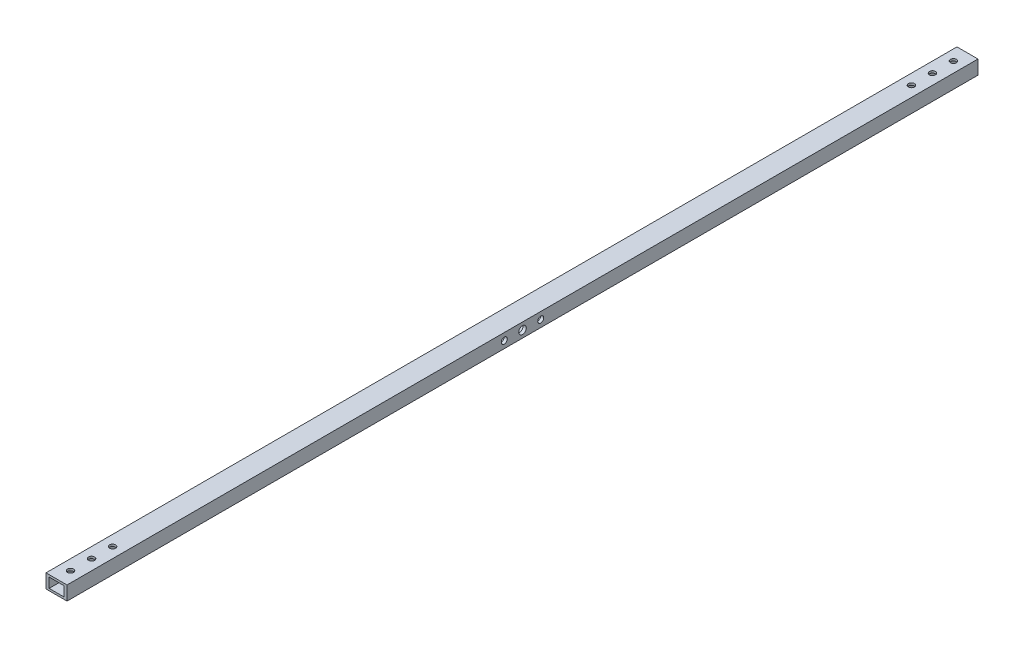
ISO-10303-21;
HEADER;
FILE_DESCRIPTION(('STEP AP214'),'2;1');
FILE_NAME('part.step','',(''),(''),'','','');
FILE_SCHEMA(('AUTOMOTIVE_DESIGN { 1 0 10303 214 1 1 1 1 }'));
ENDSEC;
DATA;
#1=APPLICATION_CONTEXT('core data for automotive mechanical design processes');
#2=APPLICATION_PROTOCOL_DEFINITION('international standard','automotive_design',2000,#1);
#3=PRODUCT_CONTEXT('',#1,'mechanical');
#4=PRODUCT('Part','Part','',(#3));
#5=PRODUCT_RELATED_PRODUCT_CATEGORY('part','',(#4));
#6=PRODUCT_DEFINITION_FORMATION('','',#4);
#7=PRODUCT_DEFINITION_CONTEXT('part definition',#1,'design');
#8=PRODUCT_DEFINITION('design','',#6,#7);
#9=PRODUCT_DEFINITION_SHAPE('','',#8);
#10=(LENGTH_UNIT() NAMED_UNIT(*) SI_UNIT(.MILLI.,.METRE.));
#11=(NAMED_UNIT(*) PLANE_ANGLE_UNIT() SI_UNIT($,.RADIAN.));
#12=(NAMED_UNIT(*) SI_UNIT($,.STERADIAN.) SOLID_ANGLE_UNIT());
#13=UNCERTAINTY_MEASURE_WITH_UNIT(LENGTH_MEASURE(1.E-05),#10,'distance_accuracy_value','');
#14=(GEOMETRIC_REPRESENTATION_CONTEXT(3) GLOBAL_UNCERTAINTY_ASSIGNED_CONTEXT((#13)) GLOBAL_UNIT_ASSIGNED_CONTEXT((#10,
#11,#12)) REPRESENTATION_CONTEXT('',''));
#15=CARTESIAN_POINT('',(0.,0.,0.));
#16=DIRECTION('',(0.,0.,1.));
#17=DIRECTION('',(1.,0.,0.));
#18=AXIS2_PLACEMENT_3D('',#15,#16,#17);
#19=CARTESIAN_POINT('',(0.,0.,650.));
#20=DIRECTION('',(0.,0.,1.));
#21=DIRECTION('',(1.,0.,0.));
#22=AXIS2_PLACEMENT_3D('',#19,#20,#21);
#23=PLANE('',#22);
#24=DIRECTION('',(0.,1.,0.));
#25=VECTOR('',#24,1.);
#26=CARTESIAN_POINT('',(7.5,5.,650.));
#27=LINE('',#26,#25);
#28=CARTESIAN_POINT('',(7.5,-5.,650.));
#29=VERTEX_POINT('',#28);
#30=CARTESIAN_POINT('',(7.5,5.,650.));
#31=VERTEX_POINT('',#30);
#32=EDGE_CURVE('E140',#29,#31,#27,.T.);
#33=ORIENTED_EDGE('',*,*,#32,.T.);
#34=DIRECTION('',(-1.,0.,0.));
#35=VECTOR('',#34,1.);
#36=CARTESIAN_POINT('',(-7.5,5.,650.));
#37=LINE('',#36,#35);
#38=CARTESIAN_POINT('',(-7.5,5.,650.));
#39=VERTEX_POINT('',#38);
#40=EDGE_CURVE('E143',#31,#39,#37,.T.);
#41=ORIENTED_EDGE('',*,*,#40,.T.);
#42=DIRECTION('',(0.,-1.,0.));
#43=VECTOR('',#42,1.);
#44=CARTESIAN_POINT('',(-7.5,5.,650.));
#45=LINE('',#44,#43);
#46=CARTESIAN_POINT('',(-7.5,-5.,650.));
#47=VERTEX_POINT('',#46);
#48=EDGE_CURVE('E146',#39,#47,#45,.T.);
#49=ORIENTED_EDGE('',*,*,#48,.T.);
#50=DIRECTION('',(1.,0.,0.));
#51=VECTOR('',#50,1.);
#52=CARTESIAN_POINT('',(-7.5,-5.,650.));
#53=LINE('',#52,#51);
#54=EDGE_CURVE('E148',#47,#29,#53,.T.);
#55=ORIENTED_EDGE('',*,*,#54,.T.);
#56=EDGE_LOOP('',(#33,#41,#49,#55));
#57=FACE_BOUND('',#56,.T.);
#58=DIRECTION('',(-1.,0.,0.));
#59=VECTOR('',#58,1.);
#60=CARTESIAN_POINT('',(-5.25,3.5,650.));
#61=LINE('',#60,#59);
#62=CARTESIAN_POINT('',(5.25,3.5,650.));
#63=VERTEX_POINT('',#62);
#64=CARTESIAN_POINT('',(-5.25,3.5,650.));
#65=VERTEX_POINT('',#64);
#66=EDGE_CURVE('E110',#63,#65,#61,.T.);
#67=ORIENTED_EDGE('',*,*,#66,.F.);
#68=DIRECTION('',(0.,1.,0.));
#69=VECTOR('',#68,1.);
#70=CARTESIAN_POINT('',(5.25,3.5,650.));
#71=LINE('',#70,#69);
#72=CARTESIAN_POINT('',(5.25,-3.5,650.));
#73=VERTEX_POINT('',#72);
#74=EDGE_CURVE('E102',#73,#63,#71,.T.);
#75=ORIENTED_EDGE('',*,*,#74,.F.);
#76=DIRECTION('',(1.,0.,0.));
#77=VECTOR('',#76,1.);
#78=CARTESIAN_POINT('',(-5.25,-3.5,650.));
#79=LINE('',#78,#77);
#80=CARTESIAN_POINT('',(-5.25,-3.5,650.));
#81=VERTEX_POINT('',#80);
#82=EDGE_CURVE('E124',#81,#73,#79,.T.);
#83=ORIENTED_EDGE('',*,*,#82,.F.);
#84=DIRECTION('',(0.,-1.,0.));
#85=VECTOR('',#84,1.);
#86=CARTESIAN_POINT('',(-5.25,3.5,650.));
#87=LINE('',#86,#85);
#88=EDGE_CURVE('E122',#65,#81,#87,.T.);
#89=ORIENTED_EDGE('',*,*,#88,.F.);
#90=EDGE_LOOP('',(#67,#75,#83,#89));
#91=FACE_BOUND('',#90,.T.);
#92=ADVANCED_FACE('F35',(#57,#91),#23,.T.);
#93=CARTESIAN_POINT('',(0.,0.,0.));
#94=DIRECTION('',(0.,0.,1.));
#95=DIRECTION('',(1.,0.,0.));
#96=AXIS2_PLACEMENT_3D('',#93,#94,#95);
#97=PLANE('',#96);
#98=DIRECTION('',(0.,1.,0.));
#99=VECTOR('',#98,1.);
#100=CARTESIAN_POINT('',(7.5,5.,0.));
#101=LINE('',#100,#99);
#102=CARTESIAN_POINT('',(7.5,-5.,0.));
#103=VERTEX_POINT('',#102);
#104=CARTESIAN_POINT('',(7.5,5.,0.));
#105=VERTEX_POINT('',#104);
#106=EDGE_CURVE('E118',#103,#105,#101,.T.);
#107=ORIENTED_EDGE('',*,*,#106,.F.);
#108=DIRECTION('',(1.,0.,0.));
#109=VECTOR('',#108,1.);
#110=CARTESIAN_POINT('',(-7.5,-5.,0.));
#111=LINE('',#110,#109);
#112=CARTESIAN_POINT('',(-7.5,-5.,0.));
#113=VERTEX_POINT('',#112);
#114=EDGE_CURVE('E144',#113,#103,#111,.T.);
#115=ORIENTED_EDGE('',*,*,#114,.F.);
#116=DIRECTION('',(0.,-1.,0.));
#117=VECTOR('',#116,1.);
#118=CARTESIAN_POINT('',(-7.5,5.,0.));
#119=LINE('',#118,#117);
#120=CARTESIAN_POINT('',(-7.5,5.,0.));
#121=VERTEX_POINT('',#120);
#122=EDGE_CURVE('E155',#121,#113,#119,.T.);
#123=ORIENTED_EDGE('',*,*,#122,.F.);
#124=DIRECTION('',(-1.,0.,0.));
#125=VECTOR('',#124,1.);
#126=CARTESIAN_POINT('',(-7.5,5.,0.));
#127=LINE('',#126,#125);
#128=EDGE_CURVE('E153',#105,#121,#127,.T.);
#129=ORIENTED_EDGE('',*,*,#128,.F.);
#130=EDGE_LOOP('',(#107,#115,#123,#129));
#131=FACE_BOUND('',#130,.T.);
#132=DIRECTION('',(0.,1.,0.));
#133=VECTOR('',#132,1.);
#134=CARTESIAN_POINT('',(5.25,3.5,0.));
#135=LINE('',#134,#133);
#136=CARTESIAN_POINT('',(5.25,-3.5,0.));
#137=VERTEX_POINT('',#136);
#138=CARTESIAN_POINT('',(5.25,3.5,0.));
#139=VERTEX_POINT('',#138);
#140=EDGE_CURVE('E60',#137,#139,#135,.T.);
#141=ORIENTED_EDGE('',*,*,#140,.T.);
#142=DIRECTION('',(-1.,0.,0.));
#143=VECTOR('',#142,1.);
#144=CARTESIAN_POINT('',(-5.25,3.5,0.));
#145=LINE('',#144,#143);
#146=CARTESIAN_POINT('',(-5.25,3.5,0.));
#147=VERTEX_POINT('',#146);
#148=EDGE_CURVE('E117',#139,#147,#145,.T.);
#149=ORIENTED_EDGE('',*,*,#148,.T.);
#150=DIRECTION('',(0.,-1.,0.));
#151=VECTOR('',#150,1.);
#152=CARTESIAN_POINT('',(-5.25,3.5,0.));
#153=LINE('',#152,#151);
#154=CARTESIAN_POINT('',(-5.25,-3.5,0.));
#155=VERTEX_POINT('',#154);
#156=EDGE_CURVE('E132',#147,#155,#153,.T.);
#157=ORIENTED_EDGE('',*,*,#156,.T.);
#158=DIRECTION('',(1.,0.,0.));
#159=VECTOR('',#158,1.);
#160=CARTESIAN_POINT('',(-5.25,-3.5,0.));
#161=LINE('',#160,#159);
#162=EDGE_CURVE('E111',#155,#137,#161,.T.);
#163=ORIENTED_EDGE('',*,*,#162,.T.);
#164=EDGE_LOOP('',(#141,#149,#157,#163));
#165=FACE_BOUND('',#164,.T.);
#166=ADVANCED_FACE('F298',(#131,#165),#97,.F.);
#167=CARTESIAN_POINT('',(7.5,5.,650.));
#168=DIRECTION('',(-1.,0.,0.));
#169=DIRECTION('',(0.,0.,1.));
#170=AXIS2_PLACEMENT_3D('',#167,#168,#169);
#171=PLANE('',#170);
#172=CARTESIAN_POINT('',(7.5,2.23575413423965E-13,338.));
#173=DIRECTION('',(1.,0.,0.));
#174=DIRECTION('',(0.,0.,-1.));
#175=AXIS2_PLACEMENT_3D('',#172,#173,#174);
#176=CIRCLE('',#175,2.1500000000001);
#177=CARTESIAN_POINT('',(7.5,2.23575413423965E-13,335.85));
#178=VERTEX_POINT('',#177);
#179=EDGE_CURVE('E339',#178,#178,#176,.T.);
#180=ORIENTED_EDGE('',*,*,#179,.F.);
#181=EDGE_LOOP('',(#180));
#182=FACE_BOUND('',#181,.T.);
#183=CARTESIAN_POINT('',(7.5,2.23575413423965E-13,312.));
#184=DIRECTION('',(1.,0.,0.));
#185=DIRECTION('',(0.,0.,-1.));
#186=AXIS2_PLACEMENT_3D('',#183,#184,#185);
#187=CIRCLE('',#186,2.1500000000001);
#188=CARTESIAN_POINT('',(7.5,2.23575413423965E-13,309.85));
#189=VERTEX_POINT('',#188);
#190=EDGE_CURVE('E333',#189,#189,#187,.T.);
#191=ORIENTED_EDGE('',*,*,#190,.F.);
#192=EDGE_LOOP('',(#191));
#193=FACE_BOUND('',#192,.T.);
#194=CARTESIAN_POINT('',(7.5,2.22981459726379E-13,325.));
#195=DIRECTION('',(1.,0.,0.));
#196=DIRECTION('',(0.,0.,-1.));
#197=AXIS2_PLACEMENT_3D('',#194,#195,#196);
#198=CIRCLE('',#197,2.70000000000016);
#199=CARTESIAN_POINT('',(7.5,2.22981459726379E-13,322.3));
#200=VERTEX_POINT('',#199);
#201=EDGE_CURVE('E205',#200,#200,#198,.T.);
#202=ORIENTED_EDGE('',*,*,#201,.F.);
#203=EDGE_LOOP('',(#202));
#204=FACE_BOUND('',#203,.T.);
#205=ORIENTED_EDGE('',*,*,#106,.T.);
#206=DIRECTION('',(0.,0.,-1.));
#207=VECTOR('',#206,1.);
#208=CARTESIAN_POINT('',(7.5,5.,650.));
#209=LINE('',#208,#207);
#210=EDGE_CURVE('E11',#31,#105,#209,.T.);
#211=ORIENTED_EDGE('',*,*,#210,.F.);
#212=ORIENTED_EDGE('',*,*,#32,.F.);
#213=DIRECTION('',(0.,0.,-1.));
#214=VECTOR('',#213,1.);
#215=CARTESIAN_POINT('',(7.5,-5.,650.));
#216=LINE('',#215,#214);
#217=EDGE_CURVE('E150',#29,#103,#216,.T.);
#218=ORIENTED_EDGE('',*,*,#217,.T.);
#219=EDGE_LOOP('',(#205,#211,#212,#218));
#220=FACE_BOUND('',#219,.T.);
#221=ADVANCED_FACE('F37',(#182,#193,#204,#220),#171,.F.);
#222=CARTESIAN_POINT('',(-7.5,5.,650.));
#223=DIRECTION('',(0.,-1.,0.));
#224=DIRECTION('',(0.,0.,-1.));
#225=AXIS2_PLACEMENT_3D('',#222,#223,#224);
#226=PLANE('',#225);
#227=CARTESIAN_POINT('',(0.,5.,640.));
#228=DIRECTION('',(0.,-1.,0.));
#229=DIRECTION('',(0.,0.,-1.));
#230=AXIS2_PLACEMENT_3D('',#227,#228,#229);
#231=CIRCLE('',#230,2.15);
#232=CARTESIAN_POINT('',(0.,5.,637.85));
#233=VERTEX_POINT('',#232);
#234=EDGE_CURVE('E169',#233,#233,#231,.T.);
#235=ORIENTED_EDGE('',*,*,#234,.T.);
#236=EDGE_LOOP('',(#235));
#237=FACE_BOUND('',#236,.T.);
#238=CARTESIAN_POINT('',(0.,5.,40.0000000000008));
#239=DIRECTION('',(0.,-1.,0.));
#240=DIRECTION('',(0.,0.,-1.));
#241=AXIS2_PLACEMENT_3D('',#238,#239,#240);
#242=CIRCLE('',#241,2.14999999999996);
#243=CARTESIAN_POINT('',(0.,5.,37.8500000000008));
#244=VERTEX_POINT('',#243);
#245=EDGE_CURVE('E218',#244,#244,#242,.T.);
#246=ORIENTED_EDGE('',*,*,#245,.T.);
#247=EDGE_LOOP('',(#246));
#248=FACE_BOUND('',#247,.T.);
#249=CARTESIAN_POINT('',(0.,5.,25.0000000000008));
#250=DIRECTION('',(0.,-1.,0.));
#251=DIRECTION('',(0.,0.,-1.));
#252=AXIS2_PLACEMENT_3D('',#249,#250,#251);
#253=CIRCLE('',#252,2.14999999999996);
#254=CARTESIAN_POINT('',(0.,5.,22.8500000000008));
#255=VERTEX_POINT('',#254);
#256=EDGE_CURVE('E241',#255,#255,#253,.T.);
#257=ORIENTED_EDGE('',*,*,#256,.T.);
#258=EDGE_LOOP('',(#257));
#259=FACE_BOUND('',#258,.T.);
#260=CARTESIAN_POINT('',(0.,5.,10.0000000000008));
#261=DIRECTION('',(0.,-1.,0.));
#262=DIRECTION('',(0.,0.,-1.));
#263=AXIS2_PLACEMENT_3D('',#260,#261,#262);
#264=CIRCLE('',#263,2.14999999999996);
#265=CARTESIAN_POINT('',(0.,5.,7.85000000000081));
#266=VERTEX_POINT('',#265);
#267=EDGE_CURVE('E235',#266,#266,#264,.T.);
#268=ORIENTED_EDGE('',*,*,#267,.T.);
#269=EDGE_LOOP('',(#268));
#270=FACE_BOUND('',#269,.T.);
#271=CARTESIAN_POINT('',(0.,5.,610.));
#272=DIRECTION('',(0.,-1.,0.));
#273=DIRECTION('',(0.,0.,-1.));
#274=AXIS2_PLACEMENT_3D('',#271,#272,#273);
#275=CIRCLE('',#274,2.15);
#276=CARTESIAN_POINT('',(0.,5.,607.85));
#277=VERTEX_POINT('',#276);
#278=EDGE_CURVE('E229',#277,#277,#275,.T.);
#279=ORIENTED_EDGE('',*,*,#278,.T.);
#280=EDGE_LOOP('',(#279));
#281=FACE_BOUND('',#280,.T.);
#282=CARTESIAN_POINT('',(0.,5.,625.));
#283=DIRECTION('',(0.,-1.,0.));
#284=DIRECTION('',(0.,0.,-1.));
#285=AXIS2_PLACEMENT_3D('',#282,#283,#284);
#286=CIRCLE('',#285,2.15);
#287=CARTESIAN_POINT('',(0.,5.,622.85));
#288=VERTEX_POINT('',#287);
#289=EDGE_CURVE('E217',#288,#288,#286,.T.);
#290=ORIENTED_EDGE('',*,*,#289,.T.);
#291=EDGE_LOOP('',(#290));
#292=FACE_BOUND('',#291,.T.);
#293=ORIENTED_EDGE('',*,*,#128,.T.);
#294=DIRECTION('',(0.,0.,-1.));
#295=VECTOR('',#294,1.);
#296=CARTESIAN_POINT('',(-7.5,5.,650.));
#297=LINE('',#296,#295);
#298=EDGE_CURVE('E44',#39,#121,#297,.T.);
#299=ORIENTED_EDGE('',*,*,#298,.F.);
#300=ORIENTED_EDGE('',*,*,#40,.F.);
#301=ORIENTED_EDGE('',*,*,#210,.T.);
#302=EDGE_LOOP('',(#293,#299,#300,#301));
#303=FACE_BOUND('',#302,.T.);
#304=ADVANCED_FACE('F284',(#237,#248,#259,#270,#281,#292,#303),#226,.F.);
#305=CARTESIAN_POINT('',(-7.5,5.,650.));
#306=DIRECTION('',(1.,0.,0.));
#307=DIRECTION('',(0.,0.,-1.));
#308=AXIS2_PLACEMENT_3D('',#305,#306,#307);
#309=PLANE('',#308);
#310=CARTESIAN_POINT('',(-7.5,2.23575413423965E-13,338.));
#311=DIRECTION('',(1.,0.,0.));
#312=DIRECTION('',(0.,0.,-1.));
#313=AXIS2_PLACEMENT_3D('',#310,#311,#312);
#314=CIRCLE('',#313,2.1500000000001);
#315=CARTESIAN_POINT('',(-7.5,2.23575413423965E-13,335.85));
#316=VERTEX_POINT('',#315);
#317=EDGE_CURVE('E192',#316,#316,#314,.T.);
#318=ORIENTED_EDGE('',*,*,#317,.T.);
#319=EDGE_LOOP('',(#318));
#320=FACE_BOUND('',#319,.T.);
#321=CARTESIAN_POINT('',(-7.5,2.23575413423965E-13,312.));
#322=DIRECTION('',(1.,0.,0.));
#323=DIRECTION('',(0.,0.,-1.));
#324=AXIS2_PLACEMENT_3D('',#321,#322,#323);
#325=CIRCLE('',#324,2.1500000000001);
#326=CARTESIAN_POINT('',(-7.5,2.23575413423965E-13,309.85));
#327=VERTEX_POINT('',#326);
#328=EDGE_CURVE('E328',#327,#327,#325,.T.);
#329=ORIENTED_EDGE('',*,*,#328,.T.);
#330=EDGE_LOOP('',(#329));
#331=FACE_BOUND('',#330,.T.);
#332=CARTESIAN_POINT('',(-7.5,2.22981459726379E-13,325.));
#333=DIRECTION('',(1.,0.,0.));
#334=DIRECTION('',(0.,0.,-1.));
#335=AXIS2_PLACEMENT_3D('',#332,#333,#334);
#336=CIRCLE('',#335,2.70000000000016);
#337=CARTESIAN_POINT('',(-7.5,2.22981459726379E-13,322.3));
#338=VERTEX_POINT('',#337);
#339=EDGE_CURVE('E331',#338,#338,#336,.T.);
#340=ORIENTED_EDGE('',*,*,#339,.T.);
#341=EDGE_LOOP('',(#340));
#342=FACE_BOUND('',#341,.T.);
#343=ORIENTED_EDGE('',*,*,#122,.T.);
#344=DIRECTION('',(0.,0.,-1.));
#345=VECTOR('',#344,1.);
#346=CARTESIAN_POINT('',(-7.5,-5.,650.));
#347=LINE('',#346,#345);
#348=EDGE_CURVE('E160',#47,#113,#347,.T.);
#349=ORIENTED_EDGE('',*,*,#348,.F.);
#350=ORIENTED_EDGE('',*,*,#48,.F.);
#351=ORIENTED_EDGE('',*,*,#298,.T.);
#352=EDGE_LOOP('',(#343,#349,#350,#351));
#353=FACE_BOUND('',#352,.T.);
#354=ADVANCED_FACE('F287',(#320,#331,#342,#353),#309,.F.);
#355=CARTESIAN_POINT('',(-7.5,-5.,650.));
#356=DIRECTION('',(0.,1.,0.));
#357=DIRECTION('',(0.,0.,1.));
#358=AXIS2_PLACEMENT_3D('',#355,#356,#357);
#359=PLANE('',#358);
#360=CARTESIAN_POINT('',(0.,-5.,640.));
#361=DIRECTION('',(0.,-1.,0.));
#362=DIRECTION('',(0.,0.,-1.));
#363=AXIS2_PLACEMENT_3D('',#360,#361,#362);
#364=CIRCLE('',#363,2.15);
#365=CARTESIAN_POINT('',(0.,-5.,637.85));
#366=VERTEX_POINT('',#365);
#367=EDGE_CURVE('E214',#366,#366,#364,.T.);
#368=ORIENTED_EDGE('',*,*,#367,.F.);
#369=EDGE_LOOP('',(#368));
#370=FACE_BOUND('',#369,.T.);
#371=CARTESIAN_POINT('',(0.,-5.,40.0000000000008));
#372=DIRECTION('',(0.,-1.,0.));
#373=DIRECTION('',(0.,0.,-1.));
#374=AXIS2_PLACEMENT_3D('',#371,#372,#373);
#375=CIRCLE('',#374,2.14999999999996);
#376=CARTESIAN_POINT('',(0.,-5.,37.8500000000008));
#377=VERTEX_POINT('',#376);
#378=EDGE_CURVE('E211',#377,#377,#375,.T.);
#379=ORIENTED_EDGE('',*,*,#378,.F.);
#380=EDGE_LOOP('',(#379));
#381=FACE_BOUND('',#380,.T.);
#382=CARTESIAN_POINT('',(0.,-5.,25.0000000000008));
#383=DIRECTION('',(0.,-1.,0.));
#384=DIRECTION('',(0.,0.,-1.));
#385=AXIS2_PLACEMENT_3D('',#382,#383,#384);
#386=CIRCLE('',#385,2.14999999999996);
#387=CARTESIAN_POINT('',(0.,-5.,22.8500000000008));
#388=VERTEX_POINT('',#387);
#389=EDGE_CURVE('E221',#388,#388,#386,.T.);
#390=ORIENTED_EDGE('',*,*,#389,.F.);
#391=EDGE_LOOP('',(#390));
#392=FACE_BOUND('',#391,.T.);
#393=CARTESIAN_POINT('',(0.,-5.,10.0000000000008));
#394=DIRECTION('',(0.,-1.,0.));
#395=DIRECTION('',(0.,0.,-1.));
#396=AXIS2_PLACEMENT_3D('',#393,#394,#395);
#397=CIRCLE('',#396,2.14999999999996);
#398=CARTESIAN_POINT('',(0.,-5.,7.85000000000081));
#399=VERTEX_POINT('',#398);
#400=EDGE_CURVE('E238',#399,#399,#397,.T.);
#401=ORIENTED_EDGE('',*,*,#400,.F.);
#402=EDGE_LOOP('',(#401));
#403=FACE_BOUND('',#402,.T.);
#404=CARTESIAN_POINT('',(0.,-5.,610.));
#405=DIRECTION('',(0.,-1.,0.));
#406=DIRECTION('',(0.,0.,-1.));
#407=AXIS2_PLACEMENT_3D('',#404,#405,#406);
#408=CIRCLE('',#407,2.15);
#409=CARTESIAN_POINT('',(0.,-5.,607.85));
#410=VERTEX_POINT('',#409);
#411=EDGE_CURVE('E232',#410,#410,#408,.T.);
#412=ORIENTED_EDGE('',*,*,#411,.F.);
#413=EDGE_LOOP('',(#412));
#414=FACE_BOUND('',#413,.T.);
#415=CARTESIAN_POINT('',(0.,-5.,625.));
#416=DIRECTION('',(0.,-1.,0.));
#417=DIRECTION('',(0.,0.,-1.));
#418=AXIS2_PLACEMENT_3D('',#415,#416,#417);
#419=CIRCLE('',#418,2.15);
#420=CARTESIAN_POINT('',(0.,-5.,622.85));
#421=VERTEX_POINT('',#420);
#422=EDGE_CURVE('E226',#421,#421,#419,.T.);
#423=ORIENTED_EDGE('',*,*,#422,.F.);
#424=EDGE_LOOP('',(#423));
#425=FACE_BOUND('',#424,.T.);
#426=ORIENTED_EDGE('',*,*,#114,.T.);
#427=ORIENTED_EDGE('',*,*,#217,.F.);
#428=ORIENTED_EDGE('',*,*,#54,.F.);
#429=ORIENTED_EDGE('',*,*,#348,.T.);
#430=EDGE_LOOP('',(#426,#427,#428,#429));
#431=FACE_BOUND('',#430,.T.);
#432=ADVANCED_FACE('F302',(#370,#381,#392,#403,#414,#425,#431),#359,.F.);
#433=CARTESIAN_POINT('',(5.25,3.5,650.));
#434=DIRECTION('',(-1.,0.,0.));
#435=DIRECTION('',(0.,0.,1.));
#436=AXIS2_PLACEMENT_3D('',#433,#434,#435);
#437=PLANE('',#436);
#438=CARTESIAN_POINT('',(5.25,2.23575413423965E-13,338.));
#439=DIRECTION('',(-1.,0.,0.));
#440=DIRECTION('',(0.,0.,1.));
#441=AXIS2_PLACEMENT_3D('',#438,#439,#440);
#442=CIRCLE('',#441,2.1500000000001);
#443=CARTESIAN_POINT('',(5.25,2.23575413423965E-13,340.15));
#444=VERTEX_POINT('',#443);
#445=EDGE_CURVE('E208',#444,#444,#442,.T.);
#446=ORIENTED_EDGE('',*,*,#445,.F.);
#447=EDGE_LOOP('',(#446));
#448=FACE_BOUND('',#447,.T.);
#449=CARTESIAN_POINT('',(5.25,2.23575413423965E-13,312.));
#450=DIRECTION('',(-1.,0.,0.));
#451=DIRECTION('',(0.,0.,1.));
#452=AXIS2_PLACEMENT_3D('',#449,#450,#451);
#453=CIRCLE('',#452,2.1500000000001);
#454=CARTESIAN_POINT('',(5.25,2.23575413423965E-13,314.15));
#455=VERTEX_POINT('',#454);
#456=EDGE_CURVE('E195',#455,#455,#453,.T.);
#457=ORIENTED_EDGE('',*,*,#456,.F.);
#458=EDGE_LOOP('',(#457));
#459=FACE_BOUND('',#458,.T.);
#460=CARTESIAN_POINT('',(5.25,2.22981459726379E-13,325.));
#461=DIRECTION('',(-1.,0.,0.));
#462=DIRECTION('',(0.,0.,1.));
#463=AXIS2_PLACEMENT_3D('',#460,#461,#462);
#464=CIRCLE('',#463,2.70000000000016);
#465=CARTESIAN_POINT('',(5.25,2.22981459726379E-13,327.7));
#466=VERTEX_POINT('',#465);
#467=EDGE_CURVE('E191',#466,#466,#464,.T.);
#468=ORIENTED_EDGE('',*,*,#467,.F.);
#469=EDGE_LOOP('',(#468));
#470=FACE_BOUND('',#469,.T.);
#471=ORIENTED_EDGE('',*,*,#140,.F.);
#472=DIRECTION('',(0.,0.,-1.));
#473=VECTOR('',#472,1.);
#474=CARTESIAN_POINT('',(5.25,-3.5,650.));
#475=LINE('',#474,#473);
#476=EDGE_CURVE('E106',#73,#137,#475,.T.);
#477=ORIENTED_EDGE('',*,*,#476,.F.);
#478=ORIENTED_EDGE('',*,*,#74,.T.);
#479=DIRECTION('',(0.,0.,-1.));
#480=VECTOR('',#479,1.);
#481=CARTESIAN_POINT('',(5.25,3.5,650.));
#482=LINE('',#481,#480);
#483=EDGE_CURVE('E105',#63,#139,#482,.T.);
#484=ORIENTED_EDGE('',*,*,#483,.T.);
#485=EDGE_LOOP('',(#471,#477,#478,#484));
#486=FACE_BOUND('',#485,.T.);
#487=ADVANCED_FACE('F104',(#448,#459,#470,#486),#437,.T.);
#488=CARTESIAN_POINT('',(-5.25,3.5,650.));
#489=DIRECTION('',(0.,-1.,0.));
#490=DIRECTION('',(0.,0.,-1.));
#491=AXIS2_PLACEMENT_3D('',#488,#489,#490);
#492=PLANE('',#491);
#493=CARTESIAN_POINT('',(0.,3.5,640.));
#494=DIRECTION('',(0.,-1.,0.));
#495=DIRECTION('',(0.,0.,-1.));
#496=AXIS2_PLACEMENT_3D('',#493,#494,#495);
#497=CIRCLE('',#496,2.15);
#498=CARTESIAN_POINT('',(0.,3.5,637.85));
#499=VERTEX_POINT('',#498);
#500=EDGE_CURVE('E130',#499,#499,#497,.T.);
#501=ORIENTED_EDGE('',*,*,#500,.F.);
#502=EDGE_LOOP('',(#501));
#503=FACE_BOUND('',#502,.T.);
#504=CARTESIAN_POINT('',(0.,3.5,40.0000000000008));
#505=DIRECTION('',(0.,-1.,0.));
#506=DIRECTION('',(0.,0.,-1.));
#507=AXIS2_PLACEMENT_3D('',#504,#505,#506);
#508=CIRCLE('',#507,2.14999999999996);
#509=CARTESIAN_POINT('',(0.,3.5,37.8500000000008));
#510=VERTEX_POINT('',#509);
#511=EDGE_CURVE('E185',#510,#510,#508,.T.);
#512=ORIENTED_EDGE('',*,*,#511,.F.);
#513=EDGE_LOOP('',(#512));
#514=FACE_BOUND('',#513,.T.);
#515=CARTESIAN_POINT('',(0.,3.5,25.0000000000008));
#516=DIRECTION('',(0.,-1.,0.));
#517=DIRECTION('',(0.,0.,-1.));
#518=AXIS2_PLACEMENT_3D('',#515,#516,#517);
#519=CIRCLE('',#518,2.14999999999996);
#520=CARTESIAN_POINT('',(0.,3.5,22.8500000000008));
#521=VERTEX_POINT('',#520);
#522=EDGE_CURVE('E181',#521,#521,#519,.T.);
#523=ORIENTED_EDGE('',*,*,#522,.F.);
#524=EDGE_LOOP('',(#523));
#525=FACE_BOUND('',#524,.T.);
#526=CARTESIAN_POINT('',(0.,3.5,10.0000000000008));
#527=DIRECTION('',(0.,-1.,0.));
#528=DIRECTION('',(0.,0.,-1.));
#529=AXIS2_PLACEMENT_3D('',#526,#527,#528);
#530=CIRCLE('',#529,2.14999999999996);
#531=CARTESIAN_POINT('',(0.,3.5,7.85000000000081));
#532=VERTEX_POINT('',#531);
#533=EDGE_CURVE('E177',#532,#532,#530,.T.);
#534=ORIENTED_EDGE('',*,*,#533,.F.);
#535=EDGE_LOOP('',(#534));
#536=FACE_BOUND('',#535,.T.);
#537=CARTESIAN_POINT('',(0.,3.5,610.));
#538=DIRECTION('',(0.,-1.,0.));
#539=DIRECTION('',(0.,0.,-1.));
#540=AXIS2_PLACEMENT_3D('',#537,#538,#539);
#541=CIRCLE('',#540,2.15);
#542=CARTESIAN_POINT('',(0.,3.5,607.85));
#543=VERTEX_POINT('',#542);
#544=EDGE_CURVE('E173',#543,#543,#541,.T.);
#545=ORIENTED_EDGE('',*,*,#544,.F.);
#546=EDGE_LOOP('',(#545));
#547=FACE_BOUND('',#546,.T.);
#548=CARTESIAN_POINT('',(0.,3.5,625.));
#549=DIRECTION('',(0.,-1.,0.));
#550=DIRECTION('',(0.,0.,-1.));
#551=AXIS2_PLACEMENT_3D('',#548,#549,#550);
#552=CIRCLE('',#551,2.15);
#553=CARTESIAN_POINT('',(0.,3.5,622.85));
#554=VERTEX_POINT('',#553);
#555=EDGE_CURVE('E168',#554,#554,#552,.T.);
#556=ORIENTED_EDGE('',*,*,#555,.F.);
#557=EDGE_LOOP('',(#556));
#558=FACE_BOUND('',#557,.T.);
#559=ORIENTED_EDGE('',*,*,#148,.F.);
#560=ORIENTED_EDGE('',*,*,#483,.F.);
#561=ORIENTED_EDGE('',*,*,#66,.T.);
#562=DIRECTION('',(0.,0.,-1.));
#563=VECTOR('',#562,1.);
#564=CARTESIAN_POINT('',(-5.25,3.5,650.));
#565=LINE('',#564,#563);
#566=EDGE_CURVE('E119',#65,#147,#565,.T.);
#567=ORIENTED_EDGE('',*,*,#566,.T.);
#568=EDGE_LOOP('',(#559,#560,#561,#567));
#569=FACE_BOUND('',#568,.T.);
#570=ADVANCED_FACE('F114',(#503,#514,#525,#536,#547,#558,#569),#492,.T.);
#571=CARTESIAN_POINT('',(-5.25,3.5,650.));
#572=DIRECTION('',(1.,0.,0.));
#573=DIRECTION('',(0.,0.,-1.));
#574=AXIS2_PLACEMENT_3D('',#571,#572,#573);
#575=PLANE('',#574);
#576=CARTESIAN_POINT('',(-5.25,2.23575413423965E-13,338.));
#577=DIRECTION('',(1.,0.,0.));
#578=DIRECTION('',(0.,0.,-1.));
#579=AXIS2_PLACEMENT_3D('',#576,#577,#578);
#580=CIRCLE('',#579,2.1500000000001);
#581=CARTESIAN_POINT('',(-5.25,2.23575413423965E-13,335.85));
#582=VERTEX_POINT('',#581);
#583=EDGE_CURVE('E39',#582,#582,#580,.T.);
#584=ORIENTED_EDGE('',*,*,#583,.F.);
#585=EDGE_LOOP('',(#584));
#586=FACE_BOUND('',#585,.T.);
#587=CARTESIAN_POINT('',(-5.25,2.23575413423965E-13,312.));
#588=DIRECTION('',(1.,0.,0.));
#589=DIRECTION('',(0.,0.,-1.));
#590=AXIS2_PLACEMENT_3D('',#587,#588,#589);
#591=CIRCLE('',#590,2.1500000000001);
#592=CARTESIAN_POINT('',(-5.25,2.23575413423965E-13,309.85));
#593=VERTEX_POINT('',#592);
#594=EDGE_CURVE('E193',#593,#593,#591,.T.);
#595=ORIENTED_EDGE('',*,*,#594,.F.);
#596=EDGE_LOOP('',(#595));
#597=FACE_BOUND('',#596,.T.);
#598=CARTESIAN_POINT('',(-5.25,2.22981459726379E-13,325.));
#599=DIRECTION('',(1.,0.,0.));
#600=DIRECTION('',(0.,0.,-1.));
#601=AXIS2_PLACEMENT_3D('',#598,#599,#600);
#602=CIRCLE('',#601,2.70000000000016);
#603=CARTESIAN_POINT('',(-5.25,2.22981459726379E-13,322.3));
#604=VERTEX_POINT('',#603);
#605=EDGE_CURVE('E189',#604,#604,#602,.T.);
#606=ORIENTED_EDGE('',*,*,#605,.F.);
#607=EDGE_LOOP('',(#606));
#608=FACE_BOUND('',#607,.T.);
#609=ORIENTED_EDGE('',*,*,#156,.F.);
#610=ORIENTED_EDGE('',*,*,#566,.F.);
#611=ORIENTED_EDGE('',*,*,#88,.T.);
#612=DIRECTION('',(0.,0.,-1.));
#613=VECTOR('',#612,1.);
#614=CARTESIAN_POINT('',(-5.25,-3.5,650.));
#615=LINE('',#614,#613);
#616=EDGE_CURVE('E52',#81,#155,#615,.T.);
#617=ORIENTED_EDGE('',*,*,#616,.T.);
#618=EDGE_LOOP('',(#609,#610,#611,#617));
#619=FACE_BOUND('',#618,.T.);
#620=ADVANCED_FACE('F263',(#586,#597,#608,#619),#575,.T.);
#621=CARTESIAN_POINT('',(-5.25,-3.5,650.));
#622=DIRECTION('',(0.,1.,0.));
#623=DIRECTION('',(0.,0.,1.));
#624=AXIS2_PLACEMENT_3D('',#621,#622,#623);
#625=PLANE('',#624);
#626=CARTESIAN_POINT('',(0.,-3.5,640.));
#627=DIRECTION('',(0.,1.,0.));
#628=DIRECTION('',(0.,0.,1.));
#629=AXIS2_PLACEMENT_3D('',#626,#627,#628);
#630=CIRCLE('',#629,2.15);
#631=CARTESIAN_POINT('',(0.,-3.5,642.15));
#632=VERTEX_POINT('',#631);
#633=EDGE_CURVE('E186',#632,#632,#630,.T.);
#634=ORIENTED_EDGE('',*,*,#633,.F.);
#635=EDGE_LOOP('',(#634));
#636=FACE_BOUND('',#635,.T.);
#637=CARTESIAN_POINT('',(0.,-3.5,40.0000000000008));
#638=DIRECTION('',(0.,1.,0.));
#639=DIRECTION('',(0.,0.,1.));
#640=AXIS2_PLACEMENT_3D('',#637,#638,#639);
#641=CIRCLE('',#640,2.14999999999996);
#642=CARTESIAN_POINT('',(0.,-3.5,42.1500000000007));
#643=VERTEX_POINT('',#642);
#644=EDGE_CURVE('E182',#643,#643,#641,.T.);
#645=ORIENTED_EDGE('',*,*,#644,.F.);
#646=EDGE_LOOP('',(#645));
#647=FACE_BOUND('',#646,.T.);
#648=CARTESIAN_POINT('',(0.,-3.5,25.0000000000008));
#649=DIRECTION('',(0.,1.,0.));
#650=DIRECTION('',(0.,0.,1.));
#651=AXIS2_PLACEMENT_3D('',#648,#649,#650);
#652=CIRCLE('',#651,2.14999999999996);
#653=CARTESIAN_POINT('',(0.,-3.5,27.1500000000007));
#654=VERTEX_POINT('',#653);
#655=EDGE_CURVE('E178',#654,#654,#652,.T.);
#656=ORIENTED_EDGE('',*,*,#655,.F.);
#657=EDGE_LOOP('',(#656));
#658=FACE_BOUND('',#657,.T.);
#659=CARTESIAN_POINT('',(0.,-3.5,10.0000000000008));
#660=DIRECTION('',(0.,1.,0.));
#661=DIRECTION('',(0.,0.,1.));
#662=AXIS2_PLACEMENT_3D('',#659,#660,#661);
#663=CIRCLE('',#662,2.14999999999996);
#664=CARTESIAN_POINT('',(0.,-3.5,12.1500000000007));
#665=VERTEX_POINT('',#664);
#666=EDGE_CURVE('E174',#665,#665,#663,.T.);
#667=ORIENTED_EDGE('',*,*,#666,.F.);
#668=EDGE_LOOP('',(#667));
#669=FACE_BOUND('',#668,.T.);
#670=CARTESIAN_POINT('',(0.,-3.5,610.));
#671=DIRECTION('',(0.,1.,0.));
#672=DIRECTION('',(0.,0.,1.));
#673=AXIS2_PLACEMENT_3D('',#670,#671,#672);
#674=CIRCLE('',#673,2.15);
#675=CARTESIAN_POINT('',(0.,-3.5,612.15));
#676=VERTEX_POINT('',#675);
#677=EDGE_CURVE('E170',#676,#676,#674,.T.);
#678=ORIENTED_EDGE('',*,*,#677,.F.);
#679=EDGE_LOOP('',(#678));
#680=FACE_BOUND('',#679,.T.);
#681=CARTESIAN_POINT('',(0.,-3.5,625.));
#682=DIRECTION('',(0.,1.,0.));
#683=DIRECTION('',(0.,0.,1.));
#684=AXIS2_PLACEMENT_3D('',#681,#682,#683);
#685=CIRCLE('',#684,2.15);
#686=CARTESIAN_POINT('',(0.,-3.5,627.15));
#687=VERTEX_POINT('',#686);
#688=EDGE_CURVE('E165',#687,#687,#685,.T.);
#689=ORIENTED_EDGE('',*,*,#688,.F.);
#690=EDGE_LOOP('',(#689));
#691=FACE_BOUND('',#690,.T.);
#692=ORIENTED_EDGE('',*,*,#162,.F.);
#693=ORIENTED_EDGE('',*,*,#616,.F.);
#694=ORIENTED_EDGE('',*,*,#82,.T.);
#695=ORIENTED_EDGE('',*,*,#476,.T.);
#696=EDGE_LOOP('',(#692,#693,#694,#695));
#697=FACE_BOUND('',#696,.T.);
#698=ADVANCED_FACE('F379',(#636,#647,#658,#669,#680,#691,#697),#625,.T.);
#699=CARTESIAN_POINT('',(0.,5.,625.));
#700=DIRECTION('',(0.,-1.,0.));
#701=DIRECTION('',(0.,0.,-1.));
#702=AXIS2_PLACEMENT_3D('',#699,#700,#701);
#703=CYLINDRICAL_SURFACE('',#702,2.15);
#704=ORIENTED_EDGE('',*,*,#688,.T.);
#705=EDGE_LOOP('',(#704));
#706=FACE_BOUND('',#705,.T.);
#707=ORIENTED_EDGE('',*,*,#422,.T.);
#708=EDGE_LOOP('',(#707));
#709=FACE_BOUND('',#708,.T.);
#710=ADVANCED_FACE('F281',(#706,#709),#703,.F.);
#711=CARTESIAN_POINT('',(0.,5.,610.));
#712=DIRECTION('',(0.,-1.,0.));
#713=DIRECTION('',(0.,0.,-1.));
#714=AXIS2_PLACEMENT_3D('',#711,#712,#713);
#715=CYLINDRICAL_SURFACE('',#714,2.15);
#716=ORIENTED_EDGE('',*,*,#677,.T.);
#717=EDGE_LOOP('',(#716));
#718=FACE_BOUND('',#717,.T.);
#719=ORIENTED_EDGE('',*,*,#411,.T.);
#720=EDGE_LOOP('',(#719));
#721=FACE_BOUND('',#720,.T.);
#722=ADVANCED_FACE('F389',(#718,#721),#715,.F.);
#723=CARTESIAN_POINT('',(0.,5.,10.0000000000008));
#724=DIRECTION('',(0.,-1.,0.));
#725=DIRECTION('',(0.,0.,-1.));
#726=AXIS2_PLACEMENT_3D('',#723,#724,#725);
#727=CYLINDRICAL_SURFACE('',#726,2.14999999999996);
#728=ORIENTED_EDGE('',*,*,#666,.T.);
#729=EDGE_LOOP('',(#728));
#730=FACE_BOUND('',#729,.T.);
#731=ORIENTED_EDGE('',*,*,#400,.T.);
#732=EDGE_LOOP('',(#731));
#733=FACE_BOUND('',#732,.T.);
#734=ADVANCED_FACE('F398',(#730,#733),#727,.F.);
#735=CARTESIAN_POINT('',(0.,5.,25.0000000000008));
#736=DIRECTION('',(0.,-1.,0.));
#737=DIRECTION('',(0.,0.,-1.));
#738=AXIS2_PLACEMENT_3D('',#735,#736,#737);
#739=CYLINDRICAL_SURFACE('',#738,2.14999999999996);
#740=ORIENTED_EDGE('',*,*,#655,.T.);
#741=EDGE_LOOP('',(#740));
#742=FACE_BOUND('',#741,.T.);
#743=ORIENTED_EDGE('',*,*,#389,.T.);
#744=EDGE_LOOP('',(#743));
#745=FACE_BOUND('',#744,.T.);
#746=ADVANCED_FACE('F394',(#742,#745),#739,.F.);
#747=CARTESIAN_POINT('',(0.,5.,40.0000000000008));
#748=DIRECTION('',(0.,-1.,0.));
#749=DIRECTION('',(0.,0.,-1.));
#750=AXIS2_PLACEMENT_3D('',#747,#748,#749);
#751=CYLINDRICAL_SURFACE('',#750,2.14999999999996);
#752=ORIENTED_EDGE('',*,*,#644,.T.);
#753=EDGE_LOOP('',(#752));
#754=FACE_BOUND('',#753,.T.);
#755=ORIENTED_EDGE('',*,*,#378,.T.);
#756=EDGE_LOOP('',(#755));
#757=FACE_BOUND('',#756,.T.);
#758=ADVANCED_FACE('F397',(#754,#757),#751,.F.);
#759=CARTESIAN_POINT('',(0.,5.,640.));
#760=DIRECTION('',(0.,-1.,0.));
#761=DIRECTION('',(0.,0.,-1.));
#762=AXIS2_PLACEMENT_3D('',#759,#760,#761);
#763=CYLINDRICAL_SURFACE('',#762,2.15);
#764=ORIENTED_EDGE('',*,*,#633,.T.);
#765=EDGE_LOOP('',(#764));
#766=FACE_BOUND('',#765,.T.);
#767=ORIENTED_EDGE('',*,*,#367,.T.);
#768=EDGE_LOOP('',(#767));
#769=FACE_BOUND('',#768,.T.);
#770=ADVANCED_FACE('F279',(#766,#769),#763,.F.);
#771=ORIENTED_EDGE('',*,*,#555,.T.);
#772=EDGE_LOOP('',(#771));
#773=FACE_BOUND('',#772,.T.);
#774=ORIENTED_EDGE('',*,*,#289,.F.);
#775=EDGE_LOOP('',(#774));
#776=FACE_BOUND('',#775,.T.);
#777=ADVANCED_FACE('F275',(#773,#776),#703,.F.);
#778=ORIENTED_EDGE('',*,*,#544,.T.);
#779=EDGE_LOOP('',(#778));
#780=FACE_BOUND('',#779,.T.);
#781=ORIENTED_EDGE('',*,*,#278,.F.);
#782=EDGE_LOOP('',(#781));
#783=FACE_BOUND('',#782,.T.);
#784=ADVANCED_FACE('F278',(#780,#783),#715,.F.);
#785=ORIENTED_EDGE('',*,*,#533,.T.);
#786=EDGE_LOOP('',(#785));
#787=FACE_BOUND('',#786,.T.);
#788=ORIENTED_EDGE('',*,*,#267,.F.);
#789=EDGE_LOOP('',(#788));
#790=FACE_BOUND('',#789,.T.);
#791=ADVANCED_FACE('F404',(#787,#790),#727,.F.);
#792=ORIENTED_EDGE('',*,*,#522,.T.);
#793=EDGE_LOOP('',(#792));
#794=FACE_BOUND('',#793,.T.);
#795=ORIENTED_EDGE('',*,*,#256,.F.);
#796=EDGE_LOOP('',(#795));
#797=FACE_BOUND('',#796,.T.);
#798=ADVANCED_FACE('F400',(#794,#797),#739,.F.);
#799=ORIENTED_EDGE('',*,*,#511,.T.);
#800=EDGE_LOOP('',(#799));
#801=FACE_BOUND('',#800,.T.);
#802=ORIENTED_EDGE('',*,*,#245,.F.);
#803=EDGE_LOOP('',(#802));
#804=FACE_BOUND('',#803,.T.);
#805=ADVANCED_FACE('F374',(#801,#804),#751,.F.);
#806=ORIENTED_EDGE('',*,*,#500,.T.);
#807=EDGE_LOOP('',(#806));
#808=FACE_BOUND('',#807,.T.);
#809=ORIENTED_EDGE('',*,*,#234,.F.);
#810=EDGE_LOOP('',(#809));
#811=FACE_BOUND('',#810,.T.);
#812=ADVANCED_FACE('F258',(#808,#811),#763,.F.);
#813=CARTESIAN_POINT('',(-7.5,2.22981459726379E-13,325.));
#814=DIRECTION('',(1.,0.,0.));
#815=DIRECTION('',(0.,0.,-1.));
#816=AXIS2_PLACEMENT_3D('',#813,#814,#815);
#817=CYLINDRICAL_SURFACE('',#816,2.70000000000016);
#818=ORIENTED_EDGE('',*,*,#605,.T.);
#819=EDGE_LOOP('',(#818));
#820=FACE_BOUND('',#819,.T.);
#821=ORIENTED_EDGE('',*,*,#339,.F.);
#822=EDGE_LOOP('',(#821));
#823=FACE_BOUND('',#822,.T.);
#824=ADVANCED_FACE('F357',(#820,#823),#817,.F.);
#825=CARTESIAN_POINT('',(-7.5,2.23575413423965E-13,312.));
#826=DIRECTION('',(1.,0.,0.));
#827=DIRECTION('',(0.,0.,-1.));
#828=AXIS2_PLACEMENT_3D('',#825,#826,#827);
#829=CYLINDRICAL_SURFACE('',#828,2.1500000000001);
#830=ORIENTED_EDGE('',*,*,#594,.T.);
#831=EDGE_LOOP('',(#830));
#832=FACE_BOUND('',#831,.T.);
#833=ORIENTED_EDGE('',*,*,#328,.F.);
#834=EDGE_LOOP('',(#833));
#835=FACE_BOUND('',#834,.T.);
#836=ADVANCED_FACE('F364',(#832,#835),#829,.F.);
#837=CARTESIAN_POINT('',(-7.5,2.23575413423965E-13,338.));
#838=DIRECTION('',(1.,0.,0.));
#839=DIRECTION('',(0.,0.,-1.));
#840=AXIS2_PLACEMENT_3D('',#837,#838,#839);
#841=CYLINDRICAL_SURFACE('',#840,2.1500000000001);
#842=ORIENTED_EDGE('',*,*,#583,.T.);
#843=EDGE_LOOP('',(#842));
#844=FACE_BOUND('',#843,.T.);
#845=ORIENTED_EDGE('',*,*,#317,.F.);
#846=EDGE_LOOP('',(#845));
#847=FACE_BOUND('',#846,.T.);
#848=ADVANCED_FACE('F355',(#844,#847),#841,.F.);
#849=ORIENTED_EDGE('',*,*,#467,.T.);
#850=EDGE_LOOP('',(#849));
#851=FACE_BOUND('',#850,.T.);
#852=ORIENTED_EDGE('',*,*,#201,.T.);
#853=EDGE_LOOP('',(#852));
#854=FACE_BOUND('',#853,.T.);
#855=ADVANCED_FACE('F352',(#851,#854),#817,.F.);
#856=ORIENTED_EDGE('',*,*,#456,.T.);
#857=EDGE_LOOP('',(#856));
#858=FACE_BOUND('',#857,.T.);
#859=ORIENTED_EDGE('',*,*,#190,.T.);
#860=EDGE_LOOP('',(#859));
#861=FACE_BOUND('',#860,.T.);
#862=ADVANCED_FACE('F354',(#858,#861),#829,.F.);
#863=ORIENTED_EDGE('',*,*,#445,.T.);
#864=EDGE_LOOP('',(#863));
#865=FACE_BOUND('',#864,.T.);
#866=ORIENTED_EDGE('',*,*,#179,.T.);
#867=EDGE_LOOP('',(#866));
#868=FACE_BOUND('',#867,.T.);
#869=ADVANCED_FACE('F344',(#865,#868),#841,.F.);
#870=CLOSED_SHELL('',(#92,#166,#221,#304,#354,#432,#487,#570,#620,#698,#710,#722,#734,#746,#758,
#770,#777,#784,#791,#798,#805,#812,#824,#836,#848,#855,#862,#869));
#871=MANIFOLD_SOLID_BREP('B2',#870);
#872=ADVANCED_BREP_SHAPE_REPRESENTATION('',(#18,#871),#14);
#873=SHAPE_DEFINITION_REPRESENTATION(#9,#872);
ENDSEC;
END-ISO-10303-21;
